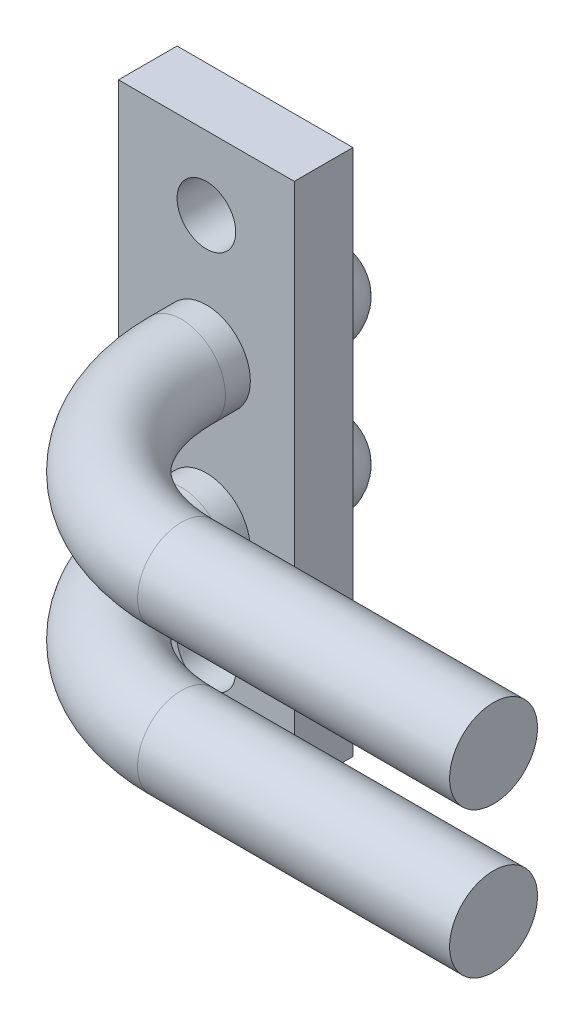
ISO-10303-21;
HEADER;
FILE_DESCRIPTION(('STEP AP214'),'2;1');
FILE_NAME('part.step','',(''),(''),'','','');
FILE_SCHEMA(('AUTOMOTIVE_DESIGN { 1 0 10303 214 1 1 1 1 }'));
ENDSEC;
DATA;
#1=APPLICATION_CONTEXT('core data for automotive mechanical design processes');
#2=APPLICATION_PROTOCOL_DEFINITION('international standard','automotive_design',2000,#1);
#3=PRODUCT_CONTEXT('',#1,'mechanical');
#4=PRODUCT('Part','Part','',(#3));
#5=PRODUCT_RELATED_PRODUCT_CATEGORY('part','',(#4));
#6=PRODUCT_DEFINITION_FORMATION('','',#4);
#7=PRODUCT_DEFINITION_CONTEXT('part definition',#1,'design');
#8=PRODUCT_DEFINITION('design','',#6,#7);
#9=PRODUCT_DEFINITION_SHAPE('','',#8);
#10=(LENGTH_UNIT() NAMED_UNIT(*) SI_UNIT(.MILLI.,.METRE.));
#11=(NAMED_UNIT(*) PLANE_ANGLE_UNIT() SI_UNIT($,.RADIAN.));
#12=(NAMED_UNIT(*) SI_UNIT($,.STERADIAN.) SOLID_ANGLE_UNIT());
#13=UNCERTAINTY_MEASURE_WITH_UNIT(LENGTH_MEASURE(1.E-05),#10,'distance_accuracy_value','');
#14=(GEOMETRIC_REPRESENTATION_CONTEXT(3) GLOBAL_UNCERTAINTY_ASSIGNED_CONTEXT((#13)) GLOBAL_UNIT_ASSIGNED_CONTEXT((#10,
#11,#12)) REPRESENTATION_CONTEXT('',''));
#15=CARTESIAN_POINT('',(0.,0.,0.));
#16=DIRECTION('',(0.,0.,1.));
#17=DIRECTION('',(1.,0.,0.));
#18=AXIS2_PLACEMENT_3D('',#15,#16,#17);
#19=CARTESIAN_POINT('',(3.,9.,2.));
#20=DIRECTION('',(0.,0.,-1.));
#21=DIRECTION('',(-1.,0.,0.));
#22=AXIS2_PLACEMENT_3D('',#19,#20,#21);
#23=PLANE('',#22);
#24=CARTESIAN_POINT('',(0.,-6.5,2.));
#25=DIRECTION('',(0.,0.,1.));
#26=DIRECTION('',(-1.,0.,0.));
#27=AXIS2_PLACEMENT_3D('',#24,#25,#26);
#28=CIRCLE('',#27,1.);
#29=CARTESIAN_POINT('',(-0.999999999999992,-6.5,2.));
#30=VERTEX_POINT('',#29);
#31=EDGE_CURVE('E130',#30,#30,#28,.T.);
#32=ORIENTED_EDGE('',*,*,#31,.F.);
#33=EDGE_LOOP('',(#32));
#34=FACE_BOUND('',#33,.T.);
#35=CARTESIAN_POINT('',(0.,6.5,2.));
#36=DIRECTION('',(0.,0.,1.));
#37=DIRECTION('',(1.,0.,0.));
#38=AXIS2_PLACEMENT_3D('',#35,#36,#37);
#39=CIRCLE('',#38,1.);
#40=CARTESIAN_POINT('',(1.,6.5,2.));
#41=VERTEX_POINT('',#40);
#42=EDGE_CURVE('E119',#41,#41,#39,.T.);
#43=ORIENTED_EDGE('',*,*,#42,.F.);
#44=EDGE_LOOP('',(#43));
#45=FACE_BOUND('',#44,.T.);
#46=CARTESIAN_POINT('',(0.,-2.62,2.));
#47=DIRECTION('',(0.,0.,1.));
#48=DIRECTION('',(1.,0.,0.));
#49=AXIS2_PLACEMENT_3D('',#46,#47,#48);
#50=CIRCLE('',#49,1.5);
#51=CARTESIAN_POINT('',(1.5,-2.62,2.));
#52=VERTEX_POINT('',#51);
#53=EDGE_CURVE('E41',#52,#52,#50,.T.);
#54=ORIENTED_EDGE('',*,*,#53,.F.);
#55=EDGE_LOOP('',(#54));
#56=FACE_BOUND('',#55,.T.);
#57=DIRECTION('',(0.,1.,0.));
#58=VECTOR('',#57,1.);
#59=CARTESIAN_POINT('',(3.,-9.,2.));
#60=LINE('',#59,#58);
#61=CARTESIAN_POINT('',(3.,-9.,2.));
#62=VERTEX_POINT('',#61);
#63=CARTESIAN_POINT('',(3.,9.,2.));
#64=VERTEX_POINT('',#63);
#65=EDGE_CURVE('E86',#62,#64,#60,.T.);
#66=ORIENTED_EDGE('',*,*,#65,.T.);
#67=DIRECTION('',(-1.,0.,0.));
#68=VECTOR('',#67,1.);
#69=CARTESIAN_POINT('',(-3.,9.,2.));
#70=LINE('',#69,#68);
#71=CARTESIAN_POINT('',(-3.,9.,2.));
#72=VERTEX_POINT('',#71);
#73=EDGE_CURVE('E81',#64,#72,#70,.T.);
#74=ORIENTED_EDGE('',*,*,#73,.T.);
#75=DIRECTION('',(0.,-1.,0.));
#76=VECTOR('',#75,1.);
#77=CARTESIAN_POINT('',(-3.,-9.,2.));
#78=LINE('',#77,#76);
#79=CARTESIAN_POINT('',(-3.,-9.,2.));
#80=VERTEX_POINT('',#79);
#81=EDGE_CURVE('E84',#72,#80,#78,.T.);
#82=ORIENTED_EDGE('',*,*,#81,.T.);
#83=DIRECTION('',(1.,0.,0.));
#84=VECTOR('',#83,1.);
#85=CARTESIAN_POINT('',(-3.,-9.,2.));
#86=LINE('',#85,#84);
#87=EDGE_CURVE('E50',#80,#62,#86,.T.);
#88=ORIENTED_EDGE('',*,*,#87,.T.);
#89=EDGE_LOOP('',(#66,#74,#82,#88));
#90=FACE_BOUND('',#89,.T.);
#91=CARTESIAN_POINT('',(0.,2.35,2.));
#92=DIRECTION('',(0.,0.,1.));
#93=DIRECTION('',(1.,0.,0.));
#94=AXIS2_PLACEMENT_3D('',#91,#92,#93);
#95=CIRCLE('',#94,1.5);
#96=CARTESIAN_POINT('',(1.5,2.35,2.));
#97=VERTEX_POINT('',#96);
#98=EDGE_CURVE('E11',#97,#97,#95,.T.);
#99=ORIENTED_EDGE('',*,*,#98,.F.);
#100=EDGE_LOOP('',(#99));
#101=FACE_BOUND('',#100,.T.);
#102=ADVANCED_FACE('F31',(#34,#45,#56,#90,#101),#23,.F.);
#103=CARTESIAN_POINT('',(3.,9.,0.));
#104=DIRECTION('',(0.,0.,-1.));
#105=DIRECTION('',(-1.,0.,0.));
#106=AXIS2_PLACEMENT_3D('',#103,#104,#105);
#107=PLANE('',#106);
#108=CARTESIAN_POINT('',(0.,-6.5,0.));
#109=DIRECTION('',(0.,0.,-1.));
#110=DIRECTION('',(-1.,0.,0.));
#111=AXIS2_PLACEMENT_3D('',#108,#109,#110);
#112=CIRCLE('',#111,1.);
#113=CARTESIAN_POINT('',(-0.999999999999992,-6.5,0.));
#114=VERTEX_POINT('',#113);
#115=EDGE_CURVE('E35',#114,#114,#112,.T.);
#116=ORIENTED_EDGE('',*,*,#115,.F.);
#117=EDGE_LOOP('',(#116));
#118=FACE_BOUND('',#117,.T.);
#119=CARTESIAN_POINT('',(0.,6.5,0.));
#120=DIRECTION('',(0.,0.,-1.));
#121=DIRECTION('',(-1.,0.,0.));
#122=AXIS2_PLACEMENT_3D('',#119,#120,#121);
#123=CIRCLE('',#122,1.);
#124=CARTESIAN_POINT('',(-1.,6.5,0.));
#125=VERTEX_POINT('',#124);
#126=EDGE_CURVE('E116',#125,#125,#123,.T.);
#127=ORIENTED_EDGE('',*,*,#126,.F.);
#128=EDGE_LOOP('',(#127));
#129=FACE_BOUND('',#128,.T.);
#130=CARTESIAN_POINT('',(0.,2.35,0.));
#131=DIRECTION('',(0.,0.,-1.));
#132=DIRECTION('',(-1.,0.,0.));
#133=AXIS2_PLACEMENT_3D('',#130,#131,#132);
#134=CIRCLE('',#133,1.5);
#135=CARTESIAN_POINT('',(-1.5,2.35,0.));
#136=VERTEX_POINT('',#135);
#137=EDGE_CURVE('E104',#136,#136,#134,.T.);
#138=ORIENTED_EDGE('',*,*,#137,.F.);
#139=EDGE_LOOP('',(#138));
#140=FACE_BOUND('',#139,.T.);
#141=DIRECTION('',(0.,1.,0.));
#142=VECTOR('',#141,1.);
#143=CARTESIAN_POINT('',(3.,-9.,0.));
#144=LINE('',#143,#142);
#145=CARTESIAN_POINT('',(3.,-9.,0.));
#146=VERTEX_POINT('',#145);
#147=CARTESIAN_POINT('',(3.,9.,0.));
#148=VERTEX_POINT('',#147);
#149=EDGE_CURVE('E101',#146,#148,#144,.T.);
#150=ORIENTED_EDGE('',*,*,#149,.F.);
#151=DIRECTION('',(1.,0.,0.));
#152=VECTOR('',#151,1.);
#153=CARTESIAN_POINT('',(-3.,-9.,0.));
#154=LINE('',#153,#152);
#155=CARTESIAN_POINT('',(-3.,-9.,0.));
#156=VERTEX_POINT('',#155);
#157=EDGE_CURVE('E73',#156,#146,#154,.T.);
#158=ORIENTED_EDGE('',*,*,#157,.F.);
#159=DIRECTION('',(0.,-1.,0.));
#160=VECTOR('',#159,1.);
#161=CARTESIAN_POINT('',(-3.,-9.,0.));
#162=LINE('',#161,#160);
#163=CARTESIAN_POINT('',(-3.,9.,0.));
#164=VERTEX_POINT('',#163);
#165=EDGE_CURVE('E67',#164,#156,#162,.T.);
#166=ORIENTED_EDGE('',*,*,#165,.F.);
#167=DIRECTION('',(-1.,0.,0.));
#168=VECTOR('',#167,1.);
#169=CARTESIAN_POINT('',(-3.,9.,0.));
#170=LINE('',#169,#168);
#171=EDGE_CURVE('E91',#148,#164,#170,.T.);
#172=ORIENTED_EDGE('',*,*,#171,.F.);
#173=EDGE_LOOP('',(#150,#158,#166,#172));
#174=FACE_BOUND('',#173,.T.);
#175=CARTESIAN_POINT('',(0.,-2.62,0.));
#176=DIRECTION('',(0.,0.,-1.));
#177=DIRECTION('',(-1.,0.,0.));
#178=AXIS2_PLACEMENT_3D('',#175,#176,#177);
#179=CIRCLE('',#178,1.5);
#180=CARTESIAN_POINT('',(-1.5,-2.62,0.));
#181=VERTEX_POINT('',#180);
#182=EDGE_CURVE('E149',#181,#181,#179,.T.);
#183=ORIENTED_EDGE('',*,*,#182,.F.);
#184=EDGE_LOOP('',(#183));
#185=FACE_BOUND('',#184,.T.);
#186=ADVANCED_FACE('F157',(#118,#129,#140,#174,#185),#107,.T.);
#187=CARTESIAN_POINT('',(3.,-9.,2.));
#188=DIRECTION('',(-1.,0.,0.));
#189=DIRECTION('',(0.,0.,1.));
#190=AXIS2_PLACEMENT_3D('',#187,#188,#189);
#191=PLANE('',#190);
#192=ORIENTED_EDGE('',*,*,#149,.T.);
#193=DIRECTION('',(0.,0.,-1.));
#194=VECTOR('',#193,1.);
#195=CARTESIAN_POINT('',(3.,9.,2.));
#196=LINE('',#195,#194);
#197=EDGE_CURVE('E92',#64,#148,#196,.T.);
#198=ORIENTED_EDGE('',*,*,#197,.F.);
#199=ORIENTED_EDGE('',*,*,#65,.F.);
#200=DIRECTION('',(0.,0.,-1.));
#201=VECTOR('',#200,1.);
#202=CARTESIAN_POINT('',(3.,-9.,2.));
#203=LINE('',#202,#201);
#204=EDGE_CURVE('E97',#62,#146,#203,.T.);
#205=ORIENTED_EDGE('',*,*,#204,.T.);
#206=EDGE_LOOP('',(#192,#198,#199,#205));
#207=FACE_BOUND('',#206,.T.);
#208=ADVANCED_FACE('F160',(#207),#191,.F.);
#209=CARTESIAN_POINT('',(-3.,9.,2.));
#210=DIRECTION('',(0.,-1.,0.));
#211=DIRECTION('',(0.,0.,-1.));
#212=AXIS2_PLACEMENT_3D('',#209,#210,#211);
#213=PLANE('',#212);
#214=ORIENTED_EDGE('',*,*,#171,.T.);
#215=DIRECTION('',(0.,0.,-1.));
#216=VECTOR('',#215,1.);
#217=CARTESIAN_POINT('',(-3.,9.,2.));
#218=LINE('',#217,#216);
#219=EDGE_CURVE('E89',#72,#164,#218,.T.);
#220=ORIENTED_EDGE('',*,*,#219,.F.);
#221=ORIENTED_EDGE('',*,*,#73,.F.);
#222=ORIENTED_EDGE('',*,*,#197,.T.);
#223=EDGE_LOOP('',(#214,#220,#221,#222));
#224=FACE_BOUND('',#223,.T.);
#225=ADVANCED_FACE('F90',(#224),#213,.F.);
#226=CARTESIAN_POINT('',(-3.,-9.,2.));
#227=DIRECTION('',(1.,0.,0.));
#228=DIRECTION('',(0.,0.,-1.));
#229=AXIS2_PLACEMENT_3D('',#226,#227,#228);
#230=PLANE('',#229);
#231=ORIENTED_EDGE('',*,*,#165,.T.);
#232=DIRECTION('',(0.,0.,-1.));
#233=VECTOR('',#232,1.);
#234=CARTESIAN_POINT('',(-3.,-9.,2.));
#235=LINE('',#234,#233);
#236=EDGE_CURVE('E93',#80,#156,#235,.T.);
#237=ORIENTED_EDGE('',*,*,#236,.F.);
#238=ORIENTED_EDGE('',*,*,#81,.F.);
#239=ORIENTED_EDGE('',*,*,#219,.T.);
#240=EDGE_LOOP('',(#231,#237,#238,#239));
#241=FACE_BOUND('',#240,.T.);
#242=ADVANCED_FACE('F95',(#241),#230,.F.);
#243=CARTESIAN_POINT('',(-3.,-9.,2.));
#244=DIRECTION('',(0.,1.,0.));
#245=DIRECTION('',(0.,0.,1.));
#246=AXIS2_PLACEMENT_3D('',#243,#244,#245);
#247=PLANE('',#246);
#248=ORIENTED_EDGE('',*,*,#157,.T.);
#249=ORIENTED_EDGE('',*,*,#204,.F.);
#250=ORIENTED_EDGE('',*,*,#87,.F.);
#251=ORIENTED_EDGE('',*,*,#236,.T.);
#252=EDGE_LOOP('',(#248,#249,#250,#251));
#253=FACE_BOUND('',#252,.T.);
#254=ADVANCED_FACE('F177',(#253),#247,.F.);
#255=CARTESIAN_POINT('',(0.,2.35,-3.));
#256=DIRECTION('',(0.,0.,1.));
#257=DIRECTION('',(1.,0.,0.));
#258=AXIS2_PLACEMENT_3D('',#255,#256,#257);
#259=CYLINDRICAL_SURFACE('',#258,1.5);
#260=CARTESIAN_POINT('',(0.,2.35,-1.5));
#261=DIRECTION('',(0.,0.,1.));
#262=DIRECTION('',(1.,0.,0.));
#263=AXIS2_PLACEMENT_3D('',#260,#261,#262);
#264=CIRCLE('',#263,1.5);
#265=CARTESIAN_POINT('',(1.5,2.35,-1.5));
#266=VERTEX_POINT('',#265);
#267=EDGE_CURVE('E114',#266,#266,#264,.T.);
#268=ORIENTED_EDGE('',*,*,#267,.T.);
#269=EDGE_LOOP('',(#268));
#270=FACE_BOUND('',#269,.T.);
#271=ORIENTED_EDGE('',*,*,#137,.T.);
#272=EDGE_LOOP('',(#271));
#273=FACE_BOUND('',#272,.T.);
#274=ADVANCED_FACE('F155',(#270,#273),#259,.T.);
#275=CARTESIAN_POINT('',(0.,-2.62,-3.));
#276=DIRECTION('',(0.,0.,1.));
#277=DIRECTION('',(1.,0.,0.));
#278=AXIS2_PLACEMENT_3D('',#275,#276,#277);
#279=CYLINDRICAL_SURFACE('',#278,1.5);
#280=CARTESIAN_POINT('',(0.,-2.62,-1.5));
#281=DIRECTION('',(0.,0.,1.));
#282=DIRECTION('',(1.,0.,0.));
#283=AXIS2_PLACEMENT_3D('',#280,#281,#282);
#284=CIRCLE('',#283,1.5);
#285=CARTESIAN_POINT('',(1.5,-2.62,-1.5));
#286=VERTEX_POINT('',#285);
#287=EDGE_CURVE('E111',#286,#286,#284,.T.);
#288=ORIENTED_EDGE('',*,*,#287,.T.);
#289=EDGE_LOOP('',(#288));
#290=FACE_BOUND('',#289,.T.);
#291=ORIENTED_EDGE('',*,*,#182,.T.);
#292=EDGE_LOOP('',(#291));
#293=FACE_BOUND('',#292,.T.);
#294=ADVANCED_FACE('F167',(#290,#293),#279,.T.);
#295=CARTESIAN_POINT('',(0.,-2.62,-1.5));
#296=DIRECTION('',(0.,0.,1.));
#297=DIRECTION('',(1.,0.,0.));
#298=AXIS2_PLACEMENT_3D('',#295,#296,#297);
#299=SPHERICAL_SURFACE('',#298,1.5);
#300=ORIENTED_EDGE('',*,*,#287,.F.);
#301=EDGE_LOOP('',(#300));
#302=FACE_BOUND('',#301,.T.);
#303=ADVANCED_FACE('F169',(#302),#299,.T.);
#304=CARTESIAN_POINT('',(0.,2.35,-1.5));
#305=DIRECTION('',(0.,0.,1.));
#306=DIRECTION('',(1.,0.,0.));
#307=AXIS2_PLACEMENT_3D('',#304,#305,#306);
#308=SPHERICAL_SURFACE('',#307,1.5);
#309=ORIENTED_EDGE('',*,*,#267,.F.);
#310=EDGE_LOOP('',(#309));
#311=FACE_BOUND('',#310,.T.);
#312=ADVANCED_FACE('F33',(#311),#308,.T.);
#313=CARTESIAN_POINT('',(6.,-2.62,8.85));
#314=DIRECTION('',(1.,0.,0.));
#315=DIRECTION('',(0.,0.,-1.));
#316=AXIS2_PLACEMENT_3D('',#313,#314,#315);
#317=CYLINDRICAL_SURFACE('',#316,1.5);
#318=CARTESIAN_POINT('',(6.,-2.62,8.85));
#319=DIRECTION('',(1.,0.,0.));
#320=DIRECTION('',(0.,0.,-1.));
#321=AXIS2_PLACEMENT_3D('',#318,#319,#320);
#322=CIRCLE('',#321,1.5);
#323=CARTESIAN_POINT('',(6.,-2.62,10.35));
#324=VERTEX_POINT('',#323);
#325=EDGE_CURVE('E141',#324,#324,#322,.T.);
#326=ORIENTED_EDGE('',*,*,#325,.T.);
#327=EDGE_LOOP('',(#326));
#328=FACE_BOUND('',#327,.T.);
#329=CARTESIAN_POINT('',(16.65,-2.62,8.85));
#330=DIRECTION('',(1.,0.,0.));
#331=DIRECTION('',(0.,0.,-1.));
#332=AXIS2_PLACEMENT_3D('',#329,#330,#331);
#333=CIRCLE('',#332,1.5);
#334=CARTESIAN_POINT('',(16.65,-2.62,7.35));
#335=VERTEX_POINT('',#334);
#336=EDGE_CURVE('E146',#335,#335,#333,.T.);
#337=ORIENTED_EDGE('',*,*,#336,.F.);
#338=EDGE_LOOP('',(#337));
#339=FACE_BOUND('',#338,.T.);
#340=ADVANCED_FACE('F237',(#328,#339),#317,.T.);
#341=CARTESIAN_POINT('',(6.,-2.62,2.85));
#342=DIRECTION('',(0.,1.,0.));
#343=DIRECTION('',(0.,0.,1.));
#344=AXIS2_PLACEMENT_3D('',#341,#342,#343);
#345=TOROIDAL_SURFACE('',#344,6.,1.5);
#346=CARTESIAN_POINT('',(0.,-2.62,2.85));
#347=DIRECTION('',(0.,0.,1.));
#348=DIRECTION('',(1.,0.,0.));
#349=AXIS2_PLACEMENT_3D('',#346,#347,#348);
#350=CIRCLE('',#349,1.5);
#351=CARTESIAN_POINT('',(-1.5,-2.62,2.85));
#352=VERTEX_POINT('',#351);
#353=EDGE_CURVE('E138',#352,#352,#350,.T.);
#354=CARTESIAN_POINT('',(6.,-2.62,2.85));
#355=DIRECTION('',(0.,1.,0.));
#356=DIRECTION('',(0.,0.,1.));
#357=AXIS2_PLACEMENT_3D('',#354,#355,#356);
#358=CIRCLE('',#357,7.5);
#359=EDGE_CURVE('',#352,#324,#358,.T.);
#360=ORIENTED_EDGE('',*,*,#353,.T.);
#361=ORIENTED_EDGE('',*,*,#325,.F.);
#362=ORIENTED_EDGE('',*,*,#359,.T.);
#363=ORIENTED_EDGE('',*,*,#359,.F.);
#364=EDGE_LOOP('',(#360,#362,#361,#363));
#365=FACE_BOUND('',#364,.T.);
#366=ADVANCED_FACE('F247',(#365),#345,.T.);
#367=CARTESIAN_POINT('',(0.,-2.62,2.85));
#368=DIRECTION('',(0.,0.,-1.));
#369=DIRECTION('',(-1.,0.,0.));
#370=AXIS2_PLACEMENT_3D('',#367,#368,#369);
#371=CYLINDRICAL_SURFACE('',#370,1.5);
#372=ORIENTED_EDGE('',*,*,#353,.F.);
#373=EDGE_LOOP('',(#372));
#374=FACE_BOUND('',#373,.T.);
#375=ORIENTED_EDGE('',*,*,#53,.T.);
#376=EDGE_LOOP('',(#375));
#377=FACE_BOUND('',#376,.T.);
#378=ADVANCED_FACE('F256',(#374,#377),#371,.T.);
#379=CARTESIAN_POINT('',(16.65,-2.62,8.85));
#380=DIRECTION('',(1.,0.,0.));
#381=DIRECTION('',(0.,0.,-1.));
#382=AXIS2_PLACEMENT_3D('',#379,#380,#381);
#383=PLANE('',#382);
#384=ORIENTED_EDGE('',*,*,#336,.T.);
#385=EDGE_LOOP('',(#384));
#386=FACE_BOUND('',#385,.T.);
#387=ADVANCED_FACE('F266',(#386),#383,.T.);
#388=CARTESIAN_POINT('',(6.,2.35,8.85));
#389=DIRECTION('',(1.,0.,0.));
#390=DIRECTION('',(0.,0.,-1.));
#391=AXIS2_PLACEMENT_3D('',#388,#389,#390);
#392=CYLINDRICAL_SURFACE('',#391,1.5);
#393=CARTESIAN_POINT('',(6.,2.35,8.85));
#394=DIRECTION('',(1.,0.,0.));
#395=DIRECTION('',(0.,0.,-1.));
#396=AXIS2_PLACEMENT_3D('',#393,#394,#395);
#397=CIRCLE('',#396,1.5);
#398=CARTESIAN_POINT('',(6.,2.35,10.35));
#399=VERTEX_POINT('',#398);
#400=EDGE_CURVE('E123',#399,#399,#397,.T.);
#401=ORIENTED_EDGE('',*,*,#400,.T.);
#402=EDGE_LOOP('',(#401));
#403=FACE_BOUND('',#402,.T.);
#404=CARTESIAN_POINT('',(16.65,2.35,8.85));
#405=DIRECTION('',(1.,0.,0.));
#406=DIRECTION('',(0.,0.,-1.));
#407=AXIS2_PLACEMENT_3D('',#404,#405,#406);
#408=CIRCLE('',#407,1.5);
#409=CARTESIAN_POINT('',(16.65,2.35,7.35));
#410=VERTEX_POINT('',#409);
#411=EDGE_CURVE('E135',#410,#410,#408,.T.);
#412=ORIENTED_EDGE('',*,*,#411,.F.);
#413=EDGE_LOOP('',(#412));
#414=FACE_BOUND('',#413,.T.);
#415=ADVANCED_FACE('F276',(#403,#414),#392,.T.);
#416=CARTESIAN_POINT('',(6.,2.35,2.85));
#417=DIRECTION('',(0.,1.,0.));
#418=DIRECTION('',(0.,0.,1.));
#419=AXIS2_PLACEMENT_3D('',#416,#417,#418);
#420=TOROIDAL_SURFACE('',#419,6.,1.5);
#421=CARTESIAN_POINT('',(0.,2.35,2.85));
#422=DIRECTION('',(0.,0.,1.));
#423=DIRECTION('',(1.,0.,0.));
#424=AXIS2_PLACEMENT_3D('',#421,#422,#423);
#425=CIRCLE('',#424,1.5);
#426=CARTESIAN_POINT('',(-1.5,2.35,2.85));
#427=VERTEX_POINT('',#426);
#428=EDGE_CURVE('E118',#427,#427,#425,.T.);
#429=CARTESIAN_POINT('',(6.,2.35,2.85));
#430=DIRECTION('',(0.,1.,0.));
#431=DIRECTION('',(0.,0.,1.));
#432=AXIS2_PLACEMENT_3D('',#429,#430,#431);
#433=CIRCLE('',#432,7.5);
#434=EDGE_CURVE('',#427,#399,#433,.T.);
#435=ORIENTED_EDGE('',*,*,#428,.T.);
#436=ORIENTED_EDGE('',*,*,#400,.F.);
#437=ORIENTED_EDGE('',*,*,#434,.T.);
#438=ORIENTED_EDGE('',*,*,#434,.F.);
#439=EDGE_LOOP('',(#435,#437,#436,#438));
#440=FACE_BOUND('',#439,.T.);
#441=ADVANCED_FACE('F286',(#440),#420,.T.);
#442=CARTESIAN_POINT('',(0.,2.35,2.85));
#443=DIRECTION('',(0.,0.,-1.));
#444=DIRECTION('',(-1.,0.,0.));
#445=AXIS2_PLACEMENT_3D('',#442,#443,#444);
#446=CYLINDRICAL_SURFACE('',#445,1.5);
#447=ORIENTED_EDGE('',*,*,#428,.F.);
#448=EDGE_LOOP('',(#447));
#449=FACE_BOUND('',#448,.T.);
#450=ORIENTED_EDGE('',*,*,#98,.T.);
#451=EDGE_LOOP('',(#450));
#452=FACE_BOUND('',#451,.T.);
#453=ADVANCED_FACE('F296',(#449,#452),#446,.T.);
#454=CARTESIAN_POINT('',(16.65,2.35,8.85));
#455=DIRECTION('',(1.,0.,0.));
#456=DIRECTION('',(0.,0.,-1.));
#457=AXIS2_PLACEMENT_3D('',#454,#455,#456);
#458=PLANE('',#457);
#459=ORIENTED_EDGE('',*,*,#411,.T.);
#460=EDGE_LOOP('',(#459));
#461=FACE_BOUND('',#460,.T.);
#462=ADVANCED_FACE('F306',(#461),#458,.T.);
#463=CARTESIAN_POINT('',(0.,6.5,-3.));
#464=DIRECTION('',(0.,0.,1.));
#465=DIRECTION('',(1.,0.,0.));
#466=AXIS2_PLACEMENT_3D('',#463,#464,#465);
#467=CYLINDRICAL_SURFACE('',#466,1.);
#468=ORIENTED_EDGE('',*,*,#126,.T.);
#469=EDGE_LOOP('',(#468));
#470=FACE_BOUND('',#469,.T.);
#471=ORIENTED_EDGE('',*,*,#42,.T.);
#472=EDGE_LOOP('',(#471));
#473=FACE_BOUND('',#472,.T.);
#474=ADVANCED_FACE('F315',(#470,#473),#467,.F.);
#475=CARTESIAN_POINT('',(0.,-6.5,-3.));
#476=DIRECTION('',(0.,0.,1.));
#477=DIRECTION('',(1.,0.,0.));
#478=AXIS2_PLACEMENT_3D('',#475,#476,#477);
#479=CYLINDRICAL_SURFACE('',#478,1.);
#480=ORIENTED_EDGE('',*,*,#115,.T.);
#481=EDGE_LOOP('',(#480));
#482=FACE_BOUND('',#481,.T.);
#483=ORIENTED_EDGE('',*,*,#31,.T.);
#484=EDGE_LOOP('',(#483));
#485=FACE_BOUND('',#484,.T.);
#486=ADVANCED_FACE('F332',(#482,#485),#479,.F.);
#487=CLOSED_SHELL('',(#102,#186,#208,#225,#242,#254,#274,#294,#303,#312,#340,#366,#378,#387,
#415,#441,#453,#462,#474,#486));
#488=MANIFOLD_SOLID_BREP('B2',#487);
#489=ADVANCED_BREP_SHAPE_REPRESENTATION('',(#18,#488),#14);
#490=SHAPE_DEFINITION_REPRESENTATION(#9,#489);
ENDSEC;
END-ISO-10303-21;
